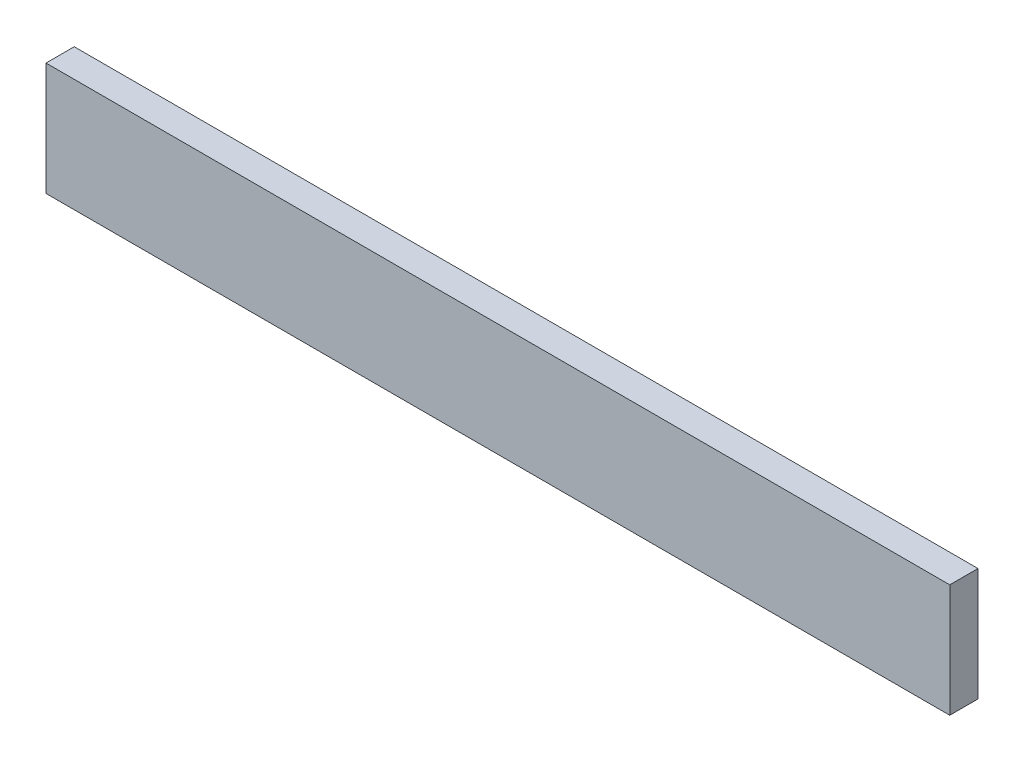
ISO-10303-21;
HEADER;
FILE_DESCRIPTION(('STEP AP214'),'2;1');
FILE_NAME('part.step','',(''),(''),'','','');
FILE_SCHEMA(('AUTOMOTIVE_DESIGN { 1 0 10303 214 1 1 1 1 }'));
ENDSEC;
DATA;
#1=APPLICATION_CONTEXT('core data for automotive mechanical design processes');
#2=APPLICATION_PROTOCOL_DEFINITION('international standard','automotive_design',2000,#1);
#3=PRODUCT_CONTEXT('',#1,'mechanical');
#4=PRODUCT('Part','Part','',(#3));
#5=PRODUCT_RELATED_PRODUCT_CATEGORY('part','',(#4));
#6=PRODUCT_DEFINITION_FORMATION('','',#4);
#7=PRODUCT_DEFINITION_CONTEXT('part definition',#1,'design');
#8=PRODUCT_DEFINITION('design','',#6,#7);
#9=PRODUCT_DEFINITION_SHAPE('','',#8);
#10=(LENGTH_UNIT() NAMED_UNIT(*) SI_UNIT(.MILLI.,.METRE.));
#11=(NAMED_UNIT(*) PLANE_ANGLE_UNIT() SI_UNIT($,.RADIAN.));
#12=(NAMED_UNIT(*) SI_UNIT($,.STERADIAN.) SOLID_ANGLE_UNIT());
#13=UNCERTAINTY_MEASURE_WITH_UNIT(LENGTH_MEASURE(1.E-05),#10,'distance_accuracy_value','');
#14=(GEOMETRIC_REPRESENTATION_CONTEXT(3) GLOBAL_UNCERTAINTY_ASSIGNED_CONTEXT((#13)) GLOBAL_UNIT_ASSIGNED_CONTEXT((#10,
#11,#12)) REPRESENTATION_CONTEXT('',''));
#15=CARTESIAN_POINT('',(0.,0.,0.));
#16=DIRECTION('',(0.,0.,1.));
#17=DIRECTION('',(1.,0.,0.));
#18=AXIS2_PLACEMENT_3D('',#15,#16,#17);
#19=CARTESIAN_POINT('',(160.,-20.,5.));
#20=DIRECTION('',(-1.,0.,0.));
#21=DIRECTION('',(0.,0.,1.));
#22=AXIS2_PLACEMENT_3D('',#19,#20,#21);
#23=PLANE('',#22);
#24=DIRECTION('',(0.,1.,0.));
#25=VECTOR('',#24,1.);
#26=CARTESIAN_POINT('',(160.,-20.,-5.));
#27=LINE('',#26,#25);
#28=CARTESIAN_POINT('',(160.,-20.,-5.));
#29=VERTEX_POINT('',#28);
#30=CARTESIAN_POINT('',(160.,20.,-5.));
#31=VERTEX_POINT('',#30);
#32=EDGE_CURVE('E96',#29,#31,#27,.T.);
#33=ORIENTED_EDGE('',*,*,#32,.T.);
#34=DIRECTION('',(0.,0.,-1.));
#35=VECTOR('',#34,1.);
#36=CARTESIAN_POINT('',(160.,20.,5.));
#37=LINE('',#36,#35);
#38=CARTESIAN_POINT('',(160.,20.,5.));
#39=VERTEX_POINT('',#38);
#40=EDGE_CURVE('E11',#39,#31,#37,.T.);
#41=ORIENTED_EDGE('',*,*,#40,.F.);
#42=DIRECTION('',(0.,1.,0.));
#43=VECTOR('',#42,1.);
#44=CARTESIAN_POINT('',(160.,-20.,5.));
#45=LINE('',#44,#43);
#46=CARTESIAN_POINT('',(160.,-20.,5.));
#47=VERTEX_POINT('',#46);
#48=EDGE_CURVE('E84',#47,#39,#45,.T.);
#49=ORIENTED_EDGE('',*,*,#48,.F.);
#50=DIRECTION('',(0.,0.,-1.));
#51=VECTOR('',#50,1.);
#52=CARTESIAN_POINT('',(160.,-20.,5.));
#53=LINE('',#52,#51);
#54=EDGE_CURVE('E92',#47,#29,#53,.T.);
#55=ORIENTED_EDGE('',*,*,#54,.T.);
#56=EDGE_LOOP('',(#33,#41,#49,#55));
#57=FACE_BOUND('',#56,.T.);
#58=ADVANCED_FACE('F33',(#57),#23,.F.);
#59=CARTESIAN_POINT('',(-160.,20.,5.));
#60=DIRECTION('',(0.,-1.,0.));
#61=DIRECTION('',(0.,0.,-1.));
#62=AXIS2_PLACEMENT_3D('',#59,#60,#61);
#63=PLANE('',#62);
#64=DIRECTION('',(-1.,0.,0.));
#65=VECTOR('',#64,1.);
#66=CARTESIAN_POINT('',(-160.,20.,-5.));
#67=LINE('',#66,#65);
#68=CARTESIAN_POINT('',(-160.,20.,-5.));
#69=VERTEX_POINT('',#68);
#70=EDGE_CURVE('E88',#31,#69,#67,.T.);
#71=ORIENTED_EDGE('',*,*,#70,.T.);
#72=DIRECTION('',(0.,0.,-1.));
#73=VECTOR('',#72,1.);
#74=CARTESIAN_POINT('',(-160.,20.,5.));
#75=LINE('',#74,#73);
#76=CARTESIAN_POINT('',(-160.,20.,5.));
#77=VERTEX_POINT('',#76);
#78=EDGE_CURVE('E41',#77,#69,#75,.T.);
#79=ORIENTED_EDGE('',*,*,#78,.F.);
#80=DIRECTION('',(-1.,0.,0.));
#81=VECTOR('',#80,1.);
#82=CARTESIAN_POINT('',(-160.,20.,5.));
#83=LINE('',#82,#81);
#84=EDGE_CURVE('E79',#39,#77,#83,.T.);
#85=ORIENTED_EDGE('',*,*,#84,.F.);
#86=ORIENTED_EDGE('',*,*,#40,.T.);
#87=EDGE_LOOP('',(#71,#79,#85,#86));
#88=FACE_BOUND('',#87,.T.);
#89=ADVANCED_FACE('F87',(#88),#63,.F.);
#90=CARTESIAN_POINT('',(-160.,-20.,5.));
#91=DIRECTION('',(1.,0.,0.));
#92=DIRECTION('',(0.,0.,-1.));
#93=AXIS2_PLACEMENT_3D('',#90,#91,#92);
#94=PLANE('',#93);
#95=DIRECTION('',(0.,-1.,0.));
#96=VECTOR('',#95,1.);
#97=CARTESIAN_POINT('',(-160.,-20.,-5.));
#98=LINE('',#97,#96);
#99=CARTESIAN_POINT('',(-160.,-20.,-5.));
#100=VERTEX_POINT('',#99);
#101=EDGE_CURVE('E66',#69,#100,#98,.T.);
#102=ORIENTED_EDGE('',*,*,#101,.T.);
#103=DIRECTION('',(0.,0.,-1.));
#104=VECTOR('',#103,1.);
#105=CARTESIAN_POINT('',(-160.,-20.,5.));
#106=LINE('',#105,#104);
#107=CARTESIAN_POINT('',(-160.,-20.,5.));
#108=VERTEX_POINT('',#107);
#109=EDGE_CURVE('E89',#108,#100,#106,.T.);
#110=ORIENTED_EDGE('',*,*,#109,.F.);
#111=DIRECTION('',(0.,-1.,0.));
#112=VECTOR('',#111,1.);
#113=CARTESIAN_POINT('',(-160.,-20.,5.));
#114=LINE('',#113,#112);
#115=EDGE_CURVE('E82',#77,#108,#114,.T.);
#116=ORIENTED_EDGE('',*,*,#115,.F.);
#117=ORIENTED_EDGE('',*,*,#78,.T.);
#118=EDGE_LOOP('',(#102,#110,#116,#117));
#119=FACE_BOUND('',#118,.T.);
#120=ADVANCED_FACE('F90',(#119),#94,.F.);
#121=CARTESIAN_POINT('',(-160.,-20.,5.));
#122=DIRECTION('',(0.,1.,0.));
#123=DIRECTION('',(0.,0.,1.));
#124=AXIS2_PLACEMENT_3D('',#121,#122,#123);
#125=PLANE('',#124);
#126=DIRECTION('',(1.,0.,0.));
#127=VECTOR('',#126,1.);
#128=CARTESIAN_POINT('',(-160.,-20.,-5.));
#129=LINE('',#128,#127);
#130=EDGE_CURVE('E72',#100,#29,#129,.T.);
#131=ORIENTED_EDGE('',*,*,#130,.T.);
#132=ORIENTED_EDGE('',*,*,#54,.F.);
#133=DIRECTION('',(1.,0.,0.));
#134=VECTOR('',#133,1.);
#135=CARTESIAN_POINT('',(-160.,-20.,5.));
#136=LINE('',#135,#134);
#137=EDGE_CURVE('E49',#108,#47,#136,.T.);
#138=ORIENTED_EDGE('',*,*,#137,.F.);
#139=ORIENTED_EDGE('',*,*,#109,.T.);
#140=EDGE_LOOP('',(#131,#132,#138,#139));
#141=FACE_BOUND('',#140,.T.);
#142=ADVANCED_FACE('F104',(#141),#125,.F.);
#143=CARTESIAN_POINT('',(0.,0.,5.));
#144=DIRECTION('',(0.,0.,-1.));
#145=DIRECTION('',(-1.,0.,0.));
#146=AXIS2_PLACEMENT_3D('',#143,#144,#145);
#147=PLANE('',#146);
#148=ORIENTED_EDGE('',*,*,#48,.T.);
#149=ORIENTED_EDGE('',*,*,#84,.T.);
#150=ORIENTED_EDGE('',*,*,#115,.T.);
#151=ORIENTED_EDGE('',*,*,#137,.T.);
#152=EDGE_LOOP('',(#148,#149,#150,#151));
#153=FACE_BOUND('',#152,.T.);
#154=ADVANCED_FACE('F80',(#153),#147,.F.);
#155=CARTESIAN_POINT('',(0.,0.,-5.));
#156=DIRECTION('',(0.,0.,-1.));
#157=DIRECTION('',(-1.,0.,0.));
#158=AXIS2_PLACEMENT_3D('',#155,#156,#157);
#159=PLANE('',#158);
#160=CARTESIAN_POINT('',(155.,-2.1614654510671E-12,-5.));
#161=DIRECTION('',(0.,0.,1.));
#162=DIRECTION('',(-1.,0.,0.));
#163=AXIS2_PLACEMENT_3D('',#160,#161,#162);
#164=CIRCLE('',#163,2.5);
#165=CARTESIAN_POINT('',(152.5,-2.1614654510671E-12,-5.));
#166=VERTEX_POINT('',#165);
#167=EDGE_CURVE('E173',#166,#166,#164,.T.);
#168=ORIENTED_EDGE('',*,*,#167,.T.);
#169=EDGE_LOOP('',(#168));
#170=FACE_BOUND('',#169,.T.);
#171=CARTESIAN_POINT('',(-155.,-2.1614654510671E-12,-5.));
#172=DIRECTION('',(0.,0.,1.));
#173=DIRECTION('',(1.,0.,0.));
#174=AXIS2_PLACEMENT_3D('',#171,#172,#173);
#175=CIRCLE('',#174,2.5);
#176=CARTESIAN_POINT('',(-152.5,-2.1614654510671E-12,-5.));
#177=VERTEX_POINT('',#176);
#178=EDGE_CURVE('E167',#177,#177,#175,.T.);
#179=ORIENTED_EDGE('',*,*,#178,.T.);
#180=EDGE_LOOP('',(#179));
#181=FACE_BOUND('',#180,.T.);
#182=CARTESIAN_POINT('',(-155.,-14.9999999999978,-5.));
#183=DIRECTION('',(0.,0.,1.));
#184=DIRECTION('',(-1.,0.,0.));
#185=AXIS2_PLACEMENT_3D('',#182,#183,#184);
#186=CIRCLE('',#185,2.5);
#187=CARTESIAN_POINT('',(-157.5,-14.9999999999978,-5.));
#188=VERTEX_POINT('',#187);
#189=EDGE_CURVE('E161',#188,#188,#186,.T.);
#190=ORIENTED_EDGE('',*,*,#189,.T.);
#191=EDGE_LOOP('',(#190));
#192=FACE_BOUND('',#191,.T.);
#193=CARTESIAN_POINT('',(-77.5,-14.9999999999984,-5.));
#194=DIRECTION('',(0.,0.,1.));
#195=DIRECTION('',(-1.,0.,0.));
#196=AXIS2_PLACEMENT_3D('',#193,#194,#195);
#197=CIRCLE('',#196,2.5);
#198=CARTESIAN_POINT('',(-80.,-14.9999999999984,-5.));
#199=VERTEX_POINT('',#198);
#200=EDGE_CURVE('E155',#199,#199,#197,.T.);
#201=ORIENTED_EDGE('',*,*,#200,.T.);
#202=EDGE_LOOP('',(#201));
#203=FACE_BOUND('',#202,.T.);
#204=CARTESIAN_POINT('',(0.,-14.9999999999989,-5.));
#205=DIRECTION('',(0.,0.,1.));
#206=DIRECTION('',(-1.,0.,0.));
#207=AXIS2_PLACEMENT_3D('',#204,#205,#206);
#208=CIRCLE('',#207,2.5);
#209=CARTESIAN_POINT('',(-2.5,-14.9999999999989,-5.));
#210=VERTEX_POINT('',#209);
#211=EDGE_CURVE('E149',#210,#210,#208,.T.);
#212=ORIENTED_EDGE('',*,*,#211,.T.);
#213=EDGE_LOOP('',(#212));
#214=FACE_BOUND('',#213,.T.);
#215=CARTESIAN_POINT('',(77.5,-14.9999999999995,-5.));
#216=DIRECTION('',(0.,0.,1.));
#217=DIRECTION('',(-1.,0.,0.));
#218=AXIS2_PLACEMENT_3D('',#215,#216,#217);
#219=CIRCLE('',#218,2.5);
#220=CARTESIAN_POINT('',(75.,-14.9999999999995,-5.));
#221=VERTEX_POINT('',#220);
#222=EDGE_CURVE('E143',#221,#221,#219,.T.);
#223=ORIENTED_EDGE('',*,*,#222,.T.);
#224=EDGE_LOOP('',(#223));
#225=FACE_BOUND('',#224,.T.);
#226=CARTESIAN_POINT('',(155.,-15.,-5.));
#227=DIRECTION('',(0.,0.,1.));
#228=DIRECTION('',(-1.,0.,0.));
#229=AXIS2_PLACEMENT_3D('',#226,#227,#228);
#230=CIRCLE('',#229,2.5);
#231=CARTESIAN_POINT('',(152.5,-15.,-5.));
#232=VERTEX_POINT('',#231);
#233=EDGE_CURVE('E137',#232,#232,#230,.T.);
#234=ORIENTED_EDGE('',*,*,#233,.T.);
#235=EDGE_LOOP('',(#234));
#236=FACE_BOUND('',#235,.T.);
#237=CARTESIAN_POINT('',(-155.,14.9999999999978,-5.));
#238=DIRECTION('',(0.,0.,1.));
#239=DIRECTION('',(1.,0.,0.));
#240=AXIS2_PLACEMENT_3D('',#237,#238,#239);
#241=CIRCLE('',#240,2.5);
#242=CARTESIAN_POINT('',(-152.5,14.9999999999978,-5.));
#243=VERTEX_POINT('',#242);
#244=EDGE_CURVE('E131',#243,#243,#241,.T.);
#245=ORIENTED_EDGE('',*,*,#244,.T.);
#246=EDGE_LOOP('',(#245));
#247=FACE_BOUND('',#246,.T.);
#248=CARTESIAN_POINT('',(-77.5,14.9999999999984,-5.));
#249=DIRECTION('',(0.,0.,1.));
#250=DIRECTION('',(1.,0.,0.));
#251=AXIS2_PLACEMENT_3D('',#248,#249,#250);
#252=CIRCLE('',#251,2.5);
#253=CARTESIAN_POINT('',(-75.,14.9999999999984,-5.));
#254=VERTEX_POINT('',#253);
#255=EDGE_CURVE('E125',#254,#254,#252,.T.);
#256=ORIENTED_EDGE('',*,*,#255,.T.);
#257=EDGE_LOOP('',(#256));
#258=FACE_BOUND('',#257,.T.);
#259=CARTESIAN_POINT('',(0.,14.9999999999989,-5.));
#260=DIRECTION('',(0.,0.,1.));
#261=DIRECTION('',(1.,0.,0.));
#262=AXIS2_PLACEMENT_3D('',#259,#260,#261);
#263=CIRCLE('',#262,2.5);
#264=CARTESIAN_POINT('',(2.5,14.9999999999989,-5.));
#265=VERTEX_POINT('',#264);
#266=EDGE_CURVE('E119',#265,#265,#263,.T.);
#267=ORIENTED_EDGE('',*,*,#266,.T.);
#268=EDGE_LOOP('',(#267));
#269=FACE_BOUND('',#268,.T.);
#270=CARTESIAN_POINT('',(77.5,14.9999999999995,-5.));
#271=DIRECTION('',(0.,0.,1.));
#272=DIRECTION('',(1.,0.,0.));
#273=AXIS2_PLACEMENT_3D('',#270,#271,#272);
#274=CIRCLE('',#273,2.5);
#275=CARTESIAN_POINT('',(80.,14.9999999999995,-5.));
#276=VERTEX_POINT('',#275);
#277=EDGE_CURVE('E113',#276,#276,#274,.T.);
#278=ORIENTED_EDGE('',*,*,#277,.T.);
#279=EDGE_LOOP('',(#278));
#280=FACE_BOUND('',#279,.T.);
#281=CARTESIAN_POINT('',(155.,15.,-5.));
#282=DIRECTION('',(0.,0.,1.));
#283=DIRECTION('',(1.,0.,0.));
#284=AXIS2_PLACEMENT_3D('',#281,#282,#283);
#285=CIRCLE('',#284,2.5);
#286=CARTESIAN_POINT('',(157.5,15.,-5.));
#287=VERTEX_POINT('',#286);
#288=EDGE_CURVE('E99',#287,#287,#285,.T.);
#289=ORIENTED_EDGE('',*,*,#288,.T.);
#290=EDGE_LOOP('',(#289));
#291=FACE_BOUND('',#290,.T.);
#292=ORIENTED_EDGE('',*,*,#32,.F.);
#293=ORIENTED_EDGE('',*,*,#130,.F.);
#294=ORIENTED_EDGE('',*,*,#101,.F.);
#295=ORIENTED_EDGE('',*,*,#70,.F.);
#296=EDGE_LOOP('',(#292,#293,#294,#295));
#297=FACE_BOUND('',#296,.T.);
#298=ADVANCED_FACE('F107',(#170,#181,#192,#203,#214,#225,#236,#247,#258,#269,#280,#291,#297),
#159,.T.);
#299=CARTESIAN_POINT('',(155.,15.,-5.));
#300=DIRECTION('',(0.,0.,1.));
#301=DIRECTION('',(1.,0.,0.));
#302=AXIS2_PLACEMENT_3D('',#299,#300,#301);
#303=CYLINDRICAL_SURFACE('',#302,2.5);
#304=ORIENTED_EDGE('',*,*,#288,.F.);
#305=EDGE_LOOP('',(#304));
#306=FACE_BOUND('',#305,.T.);
#307=CARTESIAN_POINT('',(155.,15.,0.));
#308=DIRECTION('',(0.,0.,1.));
#309=DIRECTION('',(1.,0.,0.));
#310=AXIS2_PLACEMENT_3D('',#307,#308,#309);
#311=CIRCLE('',#310,2.5);
#312=CARTESIAN_POINT('',(157.5,15.,0.));
#313=VERTEX_POINT('',#312);
#314=EDGE_CURVE('E110',#313,#313,#311,.T.);
#315=ORIENTED_EDGE('',*,*,#314,.T.);
#316=EDGE_LOOP('',(#315));
#317=FACE_BOUND('',#316,.T.);
#318=ADVANCED_FACE('F209',(#306,#317),#303,.F.);
#319=CARTESIAN_POINT('',(155.,15.,0.));
#320=DIRECTION('',(0.,0.,1.));
#321=DIRECTION('',(1.,0.,0.));
#322=AXIS2_PLACEMENT_3D('',#319,#320,#321);
#323=PLANE('',#322);
#324=ORIENTED_EDGE('',*,*,#314,.F.);
#325=EDGE_LOOP('',(#324));
#326=FACE_BOUND('',#325,.T.);
#327=ADVANCED_FACE('F214',(#326),#323,.F.);
#328=CARTESIAN_POINT('',(77.5,14.9999999999995,-5.));
#329=DIRECTION('',(0.,0.,1.));
#330=DIRECTION('',(1.,0.,0.));
#331=AXIS2_PLACEMENT_3D('',#328,#329,#330);
#332=CYLINDRICAL_SURFACE('',#331,2.5);
#333=ORIENTED_EDGE('',*,*,#277,.F.);
#334=EDGE_LOOP('',(#333));
#335=FACE_BOUND('',#334,.T.);
#336=CARTESIAN_POINT('',(77.5,14.9999999999995,0.));
#337=DIRECTION('',(0.,0.,1.));
#338=DIRECTION('',(1.,0.,0.));
#339=AXIS2_PLACEMENT_3D('',#336,#337,#338);
#340=CIRCLE('',#339,2.5);
#341=CARTESIAN_POINT('',(80.,14.9999999999995,0.));
#342=VERTEX_POINT('',#341);
#343=EDGE_CURVE('E116',#342,#342,#340,.T.);
#344=ORIENTED_EDGE('',*,*,#343,.T.);
#345=EDGE_LOOP('',(#344));
#346=FACE_BOUND('',#345,.T.);
#347=ADVANCED_FACE('F218',(#335,#346),#332,.F.);
#348=CARTESIAN_POINT('',(77.5,14.9999999999995,0.));
#349=DIRECTION('',(0.,0.,1.));
#350=DIRECTION('',(1.,0.,0.));
#351=AXIS2_PLACEMENT_3D('',#348,#349,#350);
#352=PLANE('',#351);
#353=ORIENTED_EDGE('',*,*,#343,.F.);
#354=EDGE_LOOP('',(#353));
#355=FACE_BOUND('',#354,.T.);
#356=ADVANCED_FACE('F222',(#355),#352,.F.);
#357=CARTESIAN_POINT('',(0.,14.9999999999989,-5.));
#358=DIRECTION('',(0.,0.,1.));
#359=DIRECTION('',(1.,0.,0.));
#360=AXIS2_PLACEMENT_3D('',#357,#358,#359);
#361=CYLINDRICAL_SURFACE('',#360,2.5);
#362=ORIENTED_EDGE('',*,*,#266,.F.);
#363=EDGE_LOOP('',(#362));
#364=FACE_BOUND('',#363,.T.);
#365=CARTESIAN_POINT('',(0.,14.9999999999989,0.));
#366=DIRECTION('',(0.,0.,1.));
#367=DIRECTION('',(1.,0.,0.));
#368=AXIS2_PLACEMENT_3D('',#365,#366,#367);
#369=CIRCLE('',#368,2.5);
#370=CARTESIAN_POINT('',(2.5,14.9999999999989,0.));
#371=VERTEX_POINT('',#370);
#372=EDGE_CURVE('E122',#371,#371,#369,.T.);
#373=ORIENTED_EDGE('',*,*,#372,.T.);
#374=EDGE_LOOP('',(#373));
#375=FACE_BOUND('',#374,.T.);
#376=ADVANCED_FACE('F226',(#364,#375),#361,.F.);
#377=CARTESIAN_POINT('',(0.,14.9999999999989,0.));
#378=DIRECTION('',(0.,0.,1.));
#379=DIRECTION('',(1.,0.,0.));
#380=AXIS2_PLACEMENT_3D('',#377,#378,#379);
#381=PLANE('',#380);
#382=ORIENTED_EDGE('',*,*,#372,.F.);
#383=EDGE_LOOP('',(#382));
#384=FACE_BOUND('',#383,.T.);
#385=ADVANCED_FACE('F230',(#384),#381,.F.);
#386=CARTESIAN_POINT('',(-77.5,14.9999999999984,-5.));
#387=DIRECTION('',(0.,0.,1.));
#388=DIRECTION('',(1.,0.,0.));
#389=AXIS2_PLACEMENT_3D('',#386,#387,#388);
#390=CYLINDRICAL_SURFACE('',#389,2.5);
#391=ORIENTED_EDGE('',*,*,#255,.F.);
#392=EDGE_LOOP('',(#391));
#393=FACE_BOUND('',#392,.T.);
#394=CARTESIAN_POINT('',(-77.5,14.9999999999984,0.));
#395=DIRECTION('',(0.,0.,1.));
#396=DIRECTION('',(1.,0.,0.));
#397=AXIS2_PLACEMENT_3D('',#394,#395,#396);
#398=CIRCLE('',#397,2.5);
#399=CARTESIAN_POINT('',(-75.,14.9999999999984,0.));
#400=VERTEX_POINT('',#399);
#401=EDGE_CURVE('E128',#400,#400,#398,.T.);
#402=ORIENTED_EDGE('',*,*,#401,.T.);
#403=EDGE_LOOP('',(#402));
#404=FACE_BOUND('',#403,.T.);
#405=ADVANCED_FACE('F234',(#393,#404),#390,.F.);
#406=CARTESIAN_POINT('',(-77.5,14.9999999999984,0.));
#407=DIRECTION('',(0.,0.,1.));
#408=DIRECTION('',(1.,0.,0.));
#409=AXIS2_PLACEMENT_3D('',#406,#407,#408);
#410=PLANE('',#409);
#411=ORIENTED_EDGE('',*,*,#401,.F.);
#412=EDGE_LOOP('',(#411));
#413=FACE_BOUND('',#412,.T.);
#414=ADVANCED_FACE('F238',(#413),#410,.F.);
#415=CARTESIAN_POINT('',(-155.,14.9999999999978,-5.));
#416=DIRECTION('',(0.,0.,1.));
#417=DIRECTION('',(1.,0.,0.));
#418=AXIS2_PLACEMENT_3D('',#415,#416,#417);
#419=CYLINDRICAL_SURFACE('',#418,2.5);
#420=ORIENTED_EDGE('',*,*,#244,.F.);
#421=EDGE_LOOP('',(#420));
#422=FACE_BOUND('',#421,.T.);
#423=CARTESIAN_POINT('',(-155.,14.9999999999978,0.));
#424=DIRECTION('',(0.,0.,1.));
#425=DIRECTION('',(1.,0.,0.));
#426=AXIS2_PLACEMENT_3D('',#423,#424,#425);
#427=CIRCLE('',#426,2.5);
#428=CARTESIAN_POINT('',(-152.5,14.9999999999978,0.));
#429=VERTEX_POINT('',#428);
#430=EDGE_CURVE('E134',#429,#429,#427,.T.);
#431=ORIENTED_EDGE('',*,*,#430,.T.);
#432=EDGE_LOOP('',(#431));
#433=FACE_BOUND('',#432,.T.);
#434=ADVANCED_FACE('F242',(#422,#433),#419,.F.);
#435=CARTESIAN_POINT('',(-155.,14.9999999999978,0.));
#436=DIRECTION('',(0.,0.,1.));
#437=DIRECTION('',(1.,0.,0.));
#438=AXIS2_PLACEMENT_3D('',#435,#436,#437);
#439=PLANE('',#438);
#440=ORIENTED_EDGE('',*,*,#430,.F.);
#441=EDGE_LOOP('',(#440));
#442=FACE_BOUND('',#441,.T.);
#443=ADVANCED_FACE('F246',(#442),#439,.F.);
#444=CARTESIAN_POINT('',(155.,-15.,-5.));
#445=DIRECTION('',(0.,0.,1.));
#446=DIRECTION('',(1.,0.,0.));
#447=AXIS2_PLACEMENT_3D('',#444,#445,#446);
#448=CYLINDRICAL_SURFACE('',#447,2.5);
#449=ORIENTED_EDGE('',*,*,#233,.F.);
#450=EDGE_LOOP('',(#449));
#451=FACE_BOUND('',#450,.T.);
#452=CARTESIAN_POINT('',(155.,-15.,0.));
#453=DIRECTION('',(0.,0.,1.));
#454=DIRECTION('',(-1.,0.,0.));
#455=AXIS2_PLACEMENT_3D('',#452,#453,#454);
#456=CIRCLE('',#455,2.5);
#457=CARTESIAN_POINT('',(152.5,-15.,0.));
#458=VERTEX_POINT('',#457);
#459=EDGE_CURVE('E140',#458,#458,#456,.T.);
#460=ORIENTED_EDGE('',*,*,#459,.T.);
#461=EDGE_LOOP('',(#460));
#462=FACE_BOUND('',#461,.T.);
#463=ADVANCED_FACE('F250',(#451,#462),#448,.F.);
#464=CARTESIAN_POINT('',(155.,-15.,0.));
#465=DIRECTION('',(0.,0.,-1.));
#466=DIRECTION('',(-1.,0.,0.));
#467=AXIS2_PLACEMENT_3D('',#464,#465,#466);
#468=PLANE('',#467);
#469=ORIENTED_EDGE('',*,*,#459,.F.);
#470=EDGE_LOOP('',(#469));
#471=FACE_BOUND('',#470,.T.);
#472=ADVANCED_FACE('F254',(#471),#468,.T.);
#473=CARTESIAN_POINT('',(77.5,-14.9999999999995,-5.));
#474=DIRECTION('',(0.,0.,1.));
#475=DIRECTION('',(1.,0.,0.));
#476=AXIS2_PLACEMENT_3D('',#473,#474,#475);
#477=CYLINDRICAL_SURFACE('',#476,2.5);
#478=ORIENTED_EDGE('',*,*,#222,.F.);
#479=EDGE_LOOP('',(#478));
#480=FACE_BOUND('',#479,.T.);
#481=CARTESIAN_POINT('',(77.5,-14.9999999999995,0.));
#482=DIRECTION('',(0.,0.,1.));
#483=DIRECTION('',(-1.,0.,0.));
#484=AXIS2_PLACEMENT_3D('',#481,#482,#483);
#485=CIRCLE('',#484,2.5);
#486=CARTESIAN_POINT('',(75.,-14.9999999999995,0.));
#487=VERTEX_POINT('',#486);
#488=EDGE_CURVE('E146',#487,#487,#485,.T.);
#489=ORIENTED_EDGE('',*,*,#488,.T.);
#490=EDGE_LOOP('',(#489));
#491=FACE_BOUND('',#490,.T.);
#492=ADVANCED_FACE('F258',(#480,#491),#477,.F.);
#493=CARTESIAN_POINT('',(77.5,-14.9999999999995,0.));
#494=DIRECTION('',(0.,0.,-1.));
#495=DIRECTION('',(-1.,0.,0.));
#496=AXIS2_PLACEMENT_3D('',#493,#494,#495);
#497=PLANE('',#496);
#498=ORIENTED_EDGE('',*,*,#488,.F.);
#499=EDGE_LOOP('',(#498));
#500=FACE_BOUND('',#499,.T.);
#501=ADVANCED_FACE('F262',(#500),#497,.T.);
#502=CARTESIAN_POINT('',(0.,-14.9999999999989,-5.));
#503=DIRECTION('',(0.,0.,1.));
#504=DIRECTION('',(1.,0.,0.));
#505=AXIS2_PLACEMENT_3D('',#502,#503,#504);
#506=CYLINDRICAL_SURFACE('',#505,2.5);
#507=ORIENTED_EDGE('',*,*,#211,.F.);
#508=EDGE_LOOP('',(#507));
#509=FACE_BOUND('',#508,.T.);
#510=CARTESIAN_POINT('',(0.,-14.9999999999989,0.));
#511=DIRECTION('',(0.,0.,1.));
#512=DIRECTION('',(-1.,0.,0.));
#513=AXIS2_PLACEMENT_3D('',#510,#511,#512);
#514=CIRCLE('',#513,2.5);
#515=CARTESIAN_POINT('',(-2.5,-14.9999999999989,0.));
#516=VERTEX_POINT('',#515);
#517=EDGE_CURVE('E152',#516,#516,#514,.T.);
#518=ORIENTED_EDGE('',*,*,#517,.T.);
#519=EDGE_LOOP('',(#518));
#520=FACE_BOUND('',#519,.T.);
#521=ADVANCED_FACE('F266',(#509,#520),#506,.F.);
#522=CARTESIAN_POINT('',(0.,-14.9999999999989,0.));
#523=DIRECTION('',(0.,0.,-1.));
#524=DIRECTION('',(-1.,0.,0.));
#525=AXIS2_PLACEMENT_3D('',#522,#523,#524);
#526=PLANE('',#525);
#527=ORIENTED_EDGE('',*,*,#517,.F.);
#528=EDGE_LOOP('',(#527));
#529=FACE_BOUND('',#528,.T.);
#530=ADVANCED_FACE('F270',(#529),#526,.T.);
#531=CARTESIAN_POINT('',(-77.5,-14.9999999999984,-5.));
#532=DIRECTION('',(0.,0.,1.));
#533=DIRECTION('',(1.,0.,0.));
#534=AXIS2_PLACEMENT_3D('',#531,#532,#533);
#535=CYLINDRICAL_SURFACE('',#534,2.5);
#536=ORIENTED_EDGE('',*,*,#200,.F.);
#537=EDGE_LOOP('',(#536));
#538=FACE_BOUND('',#537,.T.);
#539=CARTESIAN_POINT('',(-77.5,-14.9999999999984,0.));
#540=DIRECTION('',(0.,0.,1.));
#541=DIRECTION('',(-1.,0.,0.));
#542=AXIS2_PLACEMENT_3D('',#539,#540,#541);
#543=CIRCLE('',#542,2.5);
#544=CARTESIAN_POINT('',(-80.,-14.9999999999984,0.));
#545=VERTEX_POINT('',#544);
#546=EDGE_CURVE('E158',#545,#545,#543,.T.);
#547=ORIENTED_EDGE('',*,*,#546,.T.);
#548=EDGE_LOOP('',(#547));
#549=FACE_BOUND('',#548,.T.);
#550=ADVANCED_FACE('F274',(#538,#549),#535,.F.);
#551=CARTESIAN_POINT('',(-77.5,-14.9999999999984,0.));
#552=DIRECTION('',(0.,0.,-1.));
#553=DIRECTION('',(-1.,0.,0.));
#554=AXIS2_PLACEMENT_3D('',#551,#552,#553);
#555=PLANE('',#554);
#556=ORIENTED_EDGE('',*,*,#546,.F.);
#557=EDGE_LOOP('',(#556));
#558=FACE_BOUND('',#557,.T.);
#559=ADVANCED_FACE('F278',(#558),#555,.T.);
#560=CARTESIAN_POINT('',(-155.,-14.9999999999978,-5.));
#561=DIRECTION('',(0.,0.,1.));
#562=DIRECTION('',(1.,0.,0.));
#563=AXIS2_PLACEMENT_3D('',#560,#561,#562);
#564=CYLINDRICAL_SURFACE('',#563,2.5);
#565=ORIENTED_EDGE('',*,*,#189,.F.);
#566=EDGE_LOOP('',(#565));
#567=FACE_BOUND('',#566,.T.);
#568=CARTESIAN_POINT('',(-155.,-14.9999999999978,0.));
#569=DIRECTION('',(0.,0.,1.));
#570=DIRECTION('',(-1.,0.,0.));
#571=AXIS2_PLACEMENT_3D('',#568,#569,#570);
#572=CIRCLE('',#571,2.5);
#573=CARTESIAN_POINT('',(-157.5,-14.9999999999978,0.));
#574=VERTEX_POINT('',#573);
#575=EDGE_CURVE('E164',#574,#574,#572,.T.);
#576=ORIENTED_EDGE('',*,*,#575,.T.);
#577=EDGE_LOOP('',(#576));
#578=FACE_BOUND('',#577,.T.);
#579=ADVANCED_FACE('F282',(#567,#578),#564,.F.);
#580=CARTESIAN_POINT('',(-155.,-14.9999999999978,0.));
#581=DIRECTION('',(0.,0.,-1.));
#582=DIRECTION('',(-1.,0.,0.));
#583=AXIS2_PLACEMENT_3D('',#580,#581,#582);
#584=PLANE('',#583);
#585=ORIENTED_EDGE('',*,*,#575,.F.);
#586=EDGE_LOOP('',(#585));
#587=FACE_BOUND('',#586,.T.);
#588=ADVANCED_FACE('F286',(#587),#584,.T.);
#589=CARTESIAN_POINT('',(-155.,-2.1614654510671E-12,-5.));
#590=DIRECTION('',(0.,0.,1.));
#591=DIRECTION('',(1.,0.,0.));
#592=AXIS2_PLACEMENT_3D('',#589,#590,#591);
#593=CYLINDRICAL_SURFACE('',#592,2.5);
#594=ORIENTED_EDGE('',*,*,#178,.F.);
#595=EDGE_LOOP('',(#594));
#596=FACE_BOUND('',#595,.T.);
#597=CARTESIAN_POINT('',(-155.,-2.1614654510671E-12,0.));
#598=DIRECTION('',(0.,0.,1.));
#599=DIRECTION('',(1.,0.,0.));
#600=AXIS2_PLACEMENT_3D('',#597,#598,#599);
#601=CIRCLE('',#600,2.5);
#602=CARTESIAN_POINT('',(-152.5,-2.1614654510671E-12,0.));
#603=VERTEX_POINT('',#602);
#604=EDGE_CURVE('E170',#603,#603,#601,.T.);
#605=ORIENTED_EDGE('',*,*,#604,.T.);
#606=EDGE_LOOP('',(#605));
#607=FACE_BOUND('',#606,.T.);
#608=ADVANCED_FACE('F290',(#596,#607),#593,.F.);
#609=CARTESIAN_POINT('',(-155.,-2.1614654510671E-12,0.));
#610=DIRECTION('',(0.,0.,1.));
#611=DIRECTION('',(1.,0.,0.));
#612=AXIS2_PLACEMENT_3D('',#609,#610,#611);
#613=PLANE('',#612);
#614=ORIENTED_EDGE('',*,*,#604,.F.);
#615=EDGE_LOOP('',(#614));
#616=FACE_BOUND('',#615,.T.);
#617=ADVANCED_FACE('F188',(#616),#613,.F.);
#618=CARTESIAN_POINT('',(155.,-2.1614654510671E-12,-5.));
#619=DIRECTION('',(0.,0.,1.));
#620=DIRECTION('',(1.,0.,0.));
#621=AXIS2_PLACEMENT_3D('',#618,#619,#620);
#622=CYLINDRICAL_SURFACE('',#621,2.5);
#623=ORIENTED_EDGE('',*,*,#167,.F.);
#624=EDGE_LOOP('',(#623));
#625=FACE_BOUND('',#624,.T.);
#626=CARTESIAN_POINT('',(155.,-2.1614654510671E-12,0.));
#627=DIRECTION('',(0.,0.,1.));
#628=DIRECTION('',(-1.,0.,0.));
#629=AXIS2_PLACEMENT_3D('',#626,#627,#628);
#630=CIRCLE('',#629,2.5);
#631=CARTESIAN_POINT('',(152.5,-2.1614654510671E-12,0.));
#632=VERTEX_POINT('',#631);
#633=EDGE_CURVE('E176',#632,#632,#630,.T.);
#634=ORIENTED_EDGE('',*,*,#633,.T.);
#635=EDGE_LOOP('',(#634));
#636=FACE_BOUND('',#635,.T.);
#637=ADVANCED_FACE('F184',(#625,#636),#622,.F.);
#638=CARTESIAN_POINT('',(155.,-2.1614654510671E-12,0.));
#639=DIRECTION('',(0.,0.,-1.));
#640=DIRECTION('',(-1.,0.,0.));
#641=AXIS2_PLACEMENT_3D('',#638,#639,#640);
#642=PLANE('',#641);
#643=ORIENTED_EDGE('',*,*,#633,.F.);
#644=EDGE_LOOP('',(#643));
#645=FACE_BOUND('',#644,.T.);
#646=ADVANCED_FACE('F187',(#645),#642,.T.);
#647=CLOSED_SHELL('',(#58,#89,#120,#142,#154,#298,#318,#327,#347,#356,#376,#385,#405,#414,#434,
#443,#463,#472,#492,#501,#521,#530,#550,#559,#579,#588,#608,#617,#637,#646));
#648=MANIFOLD_SOLID_BREP('B2',#647);
#649=ADVANCED_BREP_SHAPE_REPRESENTATION('',(#18,#648),#14);
#650=SHAPE_DEFINITION_REPRESENTATION(#9,#649);
ENDSEC;
END-ISO-10303-21;
